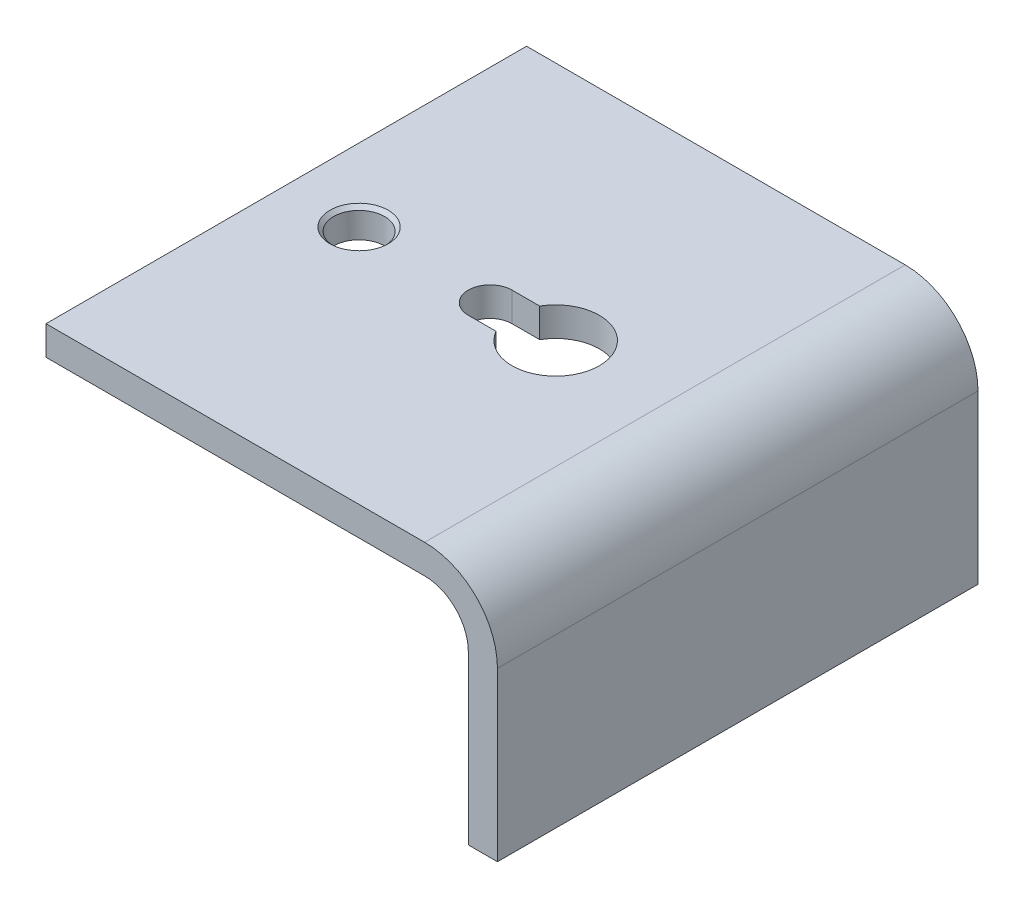
ISO-10303-21;
HEADER;
FILE_DESCRIPTION(('STEP AP214'),'2;1');
FILE_NAME('part.step','',(''),(''),'','','');
FILE_SCHEMA(('AUTOMOTIVE_DESIGN { 1 0 10303 214 1 1 1 1 }'));
ENDSEC;
DATA;
#1=APPLICATION_CONTEXT('core data for automotive mechanical design processes');
#2=APPLICATION_PROTOCOL_DEFINITION('international standard','automotive_design',2000,#1);
#3=PRODUCT_CONTEXT('',#1,'mechanical');
#4=PRODUCT('Part','Part','',(#3));
#5=PRODUCT_RELATED_PRODUCT_CATEGORY('part','',(#4));
#6=PRODUCT_DEFINITION_FORMATION('','',#4);
#7=PRODUCT_DEFINITION_CONTEXT('part definition',#1,'design');
#8=PRODUCT_DEFINITION('design','',#6,#7);
#9=PRODUCT_DEFINITION_SHAPE('','',#8);
#10=(LENGTH_UNIT() NAMED_UNIT(*) SI_UNIT(.MILLI.,.METRE.));
#11=(NAMED_UNIT(*) PLANE_ANGLE_UNIT() SI_UNIT($,.RADIAN.));
#12=(NAMED_UNIT(*) SI_UNIT($,.STERADIAN.) SOLID_ANGLE_UNIT());
#13=UNCERTAINTY_MEASURE_WITH_UNIT(LENGTH_MEASURE(1.E-05),#10,'distance_accuracy_value','');
#14=(GEOMETRIC_REPRESENTATION_CONTEXT(3) GLOBAL_UNCERTAINTY_ASSIGNED_CONTEXT((#13)) GLOBAL_UNIT_ASSIGNED_CONTEXT((#10,
#11,#12)) REPRESENTATION_CONTEXT('',''));
#15=CARTESIAN_POINT('',(0.,0.,0.));
#16=DIRECTION('',(0.,0.,1.));
#17=DIRECTION('',(1.,0.,0.));
#18=AXIS2_PLACEMENT_3D('',#15,#16,#17);
#19=CARTESIAN_POINT('',(52.,23.,66.));
#20=DIRECTION('',(0.,0.,-1.));
#21=DIRECTION('',(-1.,0.,0.));
#22=AXIS2_PLACEMENT_3D('',#19,#20,#21);
#23=CYLINDRICAL_SURFACE('',#22,10.);
#24=CARTESIAN_POINT('',(52.,23.,0.));
#25=DIRECTION('',(0.,0.,1.));
#26=DIRECTION('',(-1.,0.,0.));
#27=AXIS2_PLACEMENT_3D('',#24,#25,#26);
#28=CIRCLE('',#27,10.);
#29=CARTESIAN_POINT('',(62.,22.9999999999999,0.));
#30=VERTEX_POINT('',#29);
#31=CARTESIAN_POINT('',(51.9999999999999,33.,0.));
#32=VERTEX_POINT('',#31);
#33=EDGE_CURVE('E152',#30,#32,#28,.T.);
#34=ORIENTED_EDGE('',*,*,#33,.T.);
#35=DIRECTION('',(0.,0.,-1.));
#36=VECTOR('',#35,1.);
#37=CARTESIAN_POINT('',(51.9999999999999,33.,66.));
#38=LINE('',#37,#36);
#39=CARTESIAN_POINT('',(51.9999999999999,33.,66.));
#40=VERTEX_POINT('',#39);
#41=EDGE_CURVE('E209',#40,#32,#38,.T.);
#42=ORIENTED_EDGE('',*,*,#41,.F.);
#43=CARTESIAN_POINT('',(52.,23.,66.));
#44=DIRECTION('',(0.,0.,1.));
#45=DIRECTION('',(-1.,0.,0.));
#46=AXIS2_PLACEMENT_3D('',#43,#44,#45);
#47=CIRCLE('',#46,10.);
#48=CARTESIAN_POINT('',(62.,22.9999999999999,66.));
#49=VERTEX_POINT('',#48);
#50=EDGE_CURVE('E155',#49,#40,#47,.T.);
#51=ORIENTED_EDGE('',*,*,#50,.F.);
#52=DIRECTION('',(0.,0.,-1.));
#53=VECTOR('',#52,1.);
#54=CARTESIAN_POINT('',(62.,22.9999999999999,66.));
#55=LINE('',#54,#53);
#56=EDGE_CURVE('E173',#49,#30,#55,.T.);
#57=ORIENTED_EDGE('',*,*,#56,.T.);
#58=EDGE_LOOP('',(#34,#42,#51,#57));
#59=FACE_BOUND('',#58,.T.);
#60=ADVANCED_FACE('F36',(#59),#23,.T.);
#61=CARTESIAN_POINT('',(0.,33.,66.));
#62=DIRECTION('',(0.,-1.,0.));
#63=DIRECTION('',(0.,0.,-1.));
#64=AXIS2_PLACEMENT_3D('',#61,#62,#63);
#65=PLANE('',#64);
#66=CARTESIAN_POINT('',(9.99999999999999,33.,33.));
#67=DIRECTION('',(0.,-1.,0.));
#68=DIRECTION('',(0.,0.,-1.));
#69=AXIS2_PLACEMENT_3D('',#66,#67,#68);
#70=CIRCLE('',#69,4.00000000000002);
#71=CARTESIAN_POINT('',(9.99999999999999,33.,29.));
#72=VERTEX_POINT('',#71);
#73=EDGE_CURVE('E11',#72,#72,#70,.T.);
#74=ORIENTED_EDGE('',*,*,#73,.T.);
#75=EDGE_LOOP('',(#74));
#76=FACE_BOUND('',#75,.T.);
#77=DIRECTION('',(1.,0.,0.));
#78=VECTOR('',#77,1.);
#79=CARTESIAN_POINT('',(27.9999999999999,33.,36.));
#80=LINE('',#79,#78);
#81=CARTESIAN_POINT('',(27.9999999999999,33.,36.));
#82=VERTEX_POINT('',#81);
#83=CARTESIAN_POINT('',(31.8038475772933,33.,36.));
#84=VERTEX_POINT('',#83);
#85=EDGE_CURVE('E138',#82,#84,#80,.T.);
#86=ORIENTED_EDGE('',*,*,#85,.F.);
#87=CARTESIAN_POINT('',(27.9999999999999,33.,33.));
#88=DIRECTION('',(0.,1.,0.));
#89=DIRECTION('',(0.,0.,1.));
#90=AXIS2_PLACEMENT_3D('',#87,#88,#89);
#91=CIRCLE('',#90,3.);
#92=CARTESIAN_POINT('',(27.9999999999999,33.,30.));
#93=VERTEX_POINT('',#92);
#94=EDGE_CURVE('E52',#93,#82,#91,.T.);
#95=ORIENTED_EDGE('',*,*,#94,.F.);
#96=DIRECTION('',(-1.,0.,0.));
#97=VECTOR('',#96,1.);
#98=CARTESIAN_POINT('',(27.9999999999999,33.,30.));
#99=LINE('',#98,#97);
#100=CARTESIAN_POINT('',(31.8038475772933,33.,30.));
#101=VERTEX_POINT('',#100);
#102=EDGE_CURVE('E145',#101,#93,#99,.T.);
#103=ORIENTED_EDGE('',*,*,#102,.F.);
#104=CARTESIAN_POINT('',(36.9999999999999,33.,33.));
#105=DIRECTION('',(0.,1.,0.));
#106=DIRECTION('',(0.,0.,1.));
#107=AXIS2_PLACEMENT_3D('',#104,#105,#106);
#108=CIRCLE('',#107,5.99999999999999);
#109=EDGE_CURVE('E129',#84,#101,#108,.T.);
#110=ORIENTED_EDGE('',*,*,#109,.F.);
#111=EDGE_LOOP('',(#86,#95,#103,#110));
#112=FACE_BOUND('',#111,.T.);
#113=DIRECTION('',(-1.,0.,0.));
#114=VECTOR('',#113,1.);
#115=CARTESIAN_POINT('',(0.,33.,0.));
#116=LINE('',#115,#114);
#117=CARTESIAN_POINT('',(0.,33.,0.));
#118=VERTEX_POINT('',#117);
#119=EDGE_CURVE('E176',#32,#118,#116,.T.);
#120=ORIENTED_EDGE('',*,*,#119,.T.);
#121=DIRECTION('',(0.,0.,-1.));
#122=VECTOR('',#121,1.);
#123=CARTESIAN_POINT('',(0.,33.,66.));
#124=LINE('',#123,#122);
#125=CARTESIAN_POINT('',(0.,33.,66.));
#126=VERTEX_POINT('',#125);
#127=EDGE_CURVE('E206',#126,#118,#124,.T.);
#128=ORIENTED_EDGE('',*,*,#127,.F.);
#129=DIRECTION('',(-1.,0.,0.));
#130=VECTOR('',#129,1.);
#131=CARTESIAN_POINT('',(0.,33.,66.));
#132=LINE('',#131,#130);
#133=EDGE_CURVE('E158',#40,#126,#132,.T.);
#134=ORIENTED_EDGE('',*,*,#133,.F.);
#135=ORIENTED_EDGE('',*,*,#41,.T.);
#136=EDGE_LOOP('',(#120,#128,#134,#135));
#137=FACE_BOUND('',#136,.T.);
#138=ADVANCED_FACE('F142',(#76,#112,#137),#65,.F.);
#139=CARTESIAN_POINT('',(0.,33.,66.));
#140=DIRECTION('',(1.,0.,0.));
#141=DIRECTION('',(0.,0.,-1.));
#142=AXIS2_PLACEMENT_3D('',#139,#140,#141);
#143=PLANE('',#142);
#144=DIRECTION('',(0.,-1.,0.));
#145=VECTOR('',#144,1.);
#146=CARTESIAN_POINT('',(0.,33.,0.));
#147=LINE('',#146,#145);
#148=CARTESIAN_POINT('',(0.,29.,0.));
#149=VERTEX_POINT('',#148);
#150=EDGE_CURVE('E178',#118,#149,#147,.T.);
#151=ORIENTED_EDGE('',*,*,#150,.T.);
#152=DIRECTION('',(0.,0.,-1.));
#153=VECTOR('',#152,1.);
#154=CARTESIAN_POINT('',(0.,29.,66.));
#155=LINE('',#154,#153);
#156=CARTESIAN_POINT('',(0.,29.,66.));
#157=VERTEX_POINT('',#156);
#158=EDGE_CURVE('E203',#157,#149,#155,.T.);
#159=ORIENTED_EDGE('',*,*,#158,.F.);
#160=DIRECTION('',(0.,-1.,0.));
#161=VECTOR('',#160,1.);
#162=CARTESIAN_POINT('',(0.,33.,66.));
#163=LINE('',#162,#161);
#164=EDGE_CURVE('E161',#126,#157,#163,.T.);
#165=ORIENTED_EDGE('',*,*,#164,.F.);
#166=ORIENTED_EDGE('',*,*,#127,.T.);
#167=EDGE_LOOP('',(#151,#159,#165,#166));
#168=FACE_BOUND('',#167,.T.);
#169=ADVANCED_FACE('F241',(#168),#143,.F.);
#170=CARTESIAN_POINT('',(0.,29.,66.));
#171=DIRECTION('',(0.,1.,0.));
#172=DIRECTION('',(0.,0.,1.));
#173=AXIS2_PLACEMENT_3D('',#170,#171,#172);
#174=PLANE('',#173);
#175=CARTESIAN_POINT('',(9.99999999999999,29.,33.));
#176=DIRECTION('',(0.,1.,0.));
#177=DIRECTION('',(0.,0.,1.));
#178=AXIS2_PLACEMENT_3D('',#175,#176,#177);
#179=CIRCLE('',#178,3.5);
#180=CARTESIAN_POINT('',(9.99999999999999,29.,36.5));
#181=VERTEX_POINT('',#180);
#182=EDGE_CURVE('E221',#181,#181,#179,.T.);
#183=ORIENTED_EDGE('',*,*,#182,.T.);
#184=EDGE_LOOP('',(#183));
#185=FACE_BOUND('',#184,.T.);
#186=DIRECTION('',(-1.,0.,0.));
#187=VECTOR('',#186,1.);
#188=CARTESIAN_POINT('',(0.,29.,30.));
#189=LINE('',#188,#187);
#190=CARTESIAN_POINT('',(31.8038475772933,29.,30.));
#191=VERTEX_POINT('',#190);
#192=CARTESIAN_POINT('',(27.9999999999999,29.,30.));
#193=VERTEX_POINT('',#192);
#194=EDGE_CURVE('E215',#191,#193,#189,.T.);
#195=ORIENTED_EDGE('',*,*,#194,.T.);
#196=CARTESIAN_POINT('',(27.9999999999999,29.,33.));
#197=DIRECTION('',(0.,1.,0.));
#198=DIRECTION('',(0.,0.,1.));
#199=AXIS2_PLACEMENT_3D('',#196,#197,#198);
#200=CIRCLE('',#199,3.);
#201=CARTESIAN_POINT('',(27.9999999999999,29.,36.));
#202=VERTEX_POINT('',#201);
#203=EDGE_CURVE('E218',#193,#202,#200,.T.);
#204=ORIENTED_EDGE('',*,*,#203,.T.);
#205=DIRECTION('',(1.,0.,0.));
#206=VECTOR('',#205,1.);
#207=CARTESIAN_POINT('',(0.,29.,36.));
#208=LINE('',#207,#206);
#209=CARTESIAN_POINT('',(31.8038475772933,29.,36.));
#210=VERTEX_POINT('',#209);
#211=EDGE_CURVE('E212',#202,#210,#208,.T.);
#212=ORIENTED_EDGE('',*,*,#211,.T.);
#213=CARTESIAN_POINT('',(36.9999999999999,29.,33.));
#214=DIRECTION('',(0.,1.,0.));
#215=DIRECTION('',(0.,0.,1.));
#216=AXIS2_PLACEMENT_3D('',#213,#214,#215);
#217=CIRCLE('',#216,5.99999999999999);
#218=EDGE_CURVE('E132',#210,#191,#217,.T.);
#219=ORIENTED_EDGE('',*,*,#218,.T.);
#220=EDGE_LOOP('',(#195,#204,#212,#219));
#221=FACE_BOUND('',#220,.T.);
#222=DIRECTION('',(1.,0.,0.));
#223=VECTOR('',#222,1.);
#224=CARTESIAN_POINT('',(0.,29.,0.));
#225=LINE('',#224,#223);
#226=CARTESIAN_POINT('',(51.9999999999999,29.,0.));
#227=VERTEX_POINT('',#226);
#228=EDGE_CURVE('E180',#149,#227,#225,.T.);
#229=ORIENTED_EDGE('',*,*,#228,.T.);
#230=DIRECTION('',(0.,0.,-1.));
#231=VECTOR('',#230,1.);
#232=CARTESIAN_POINT('',(51.9999999999999,29.,66.));
#233=LINE('',#232,#231);
#234=CARTESIAN_POINT('',(51.9999999999999,29.,66.));
#235=VERTEX_POINT('',#234);
#236=EDGE_CURVE('E200',#235,#227,#233,.T.);
#237=ORIENTED_EDGE('',*,*,#236,.F.);
#238=DIRECTION('',(1.,0.,0.));
#239=VECTOR('',#238,1.);
#240=CARTESIAN_POINT('',(0.,29.,66.));
#241=LINE('',#240,#239);
#242=EDGE_CURVE('E163',#157,#235,#241,.T.);
#243=ORIENTED_EDGE('',*,*,#242,.F.);
#244=ORIENTED_EDGE('',*,*,#158,.T.);
#245=EDGE_LOOP('',(#229,#237,#243,#244));
#246=FACE_BOUND('',#245,.T.);
#247=ADVANCED_FACE('F247',(#185,#221,#246),#174,.F.);
#248=CARTESIAN_POINT('',(52.,23.,66.));
#249=DIRECTION('',(0.,0.,-1.));
#250=DIRECTION('',(-1.,0.,0.));
#251=AXIS2_PLACEMENT_3D('',#248,#249,#250);
#252=CYLINDRICAL_SURFACE('',#251,6.);
#253=CARTESIAN_POINT('',(52.,23.,0.));
#254=DIRECTION('',(0.,0.,-1.));
#255=DIRECTION('',(-1.,0.,0.));
#256=AXIS2_PLACEMENT_3D('',#253,#254,#255);
#257=CIRCLE('',#256,6.);
#258=CARTESIAN_POINT('',(58.,23.,0.));
#259=VERTEX_POINT('',#258);
#260=EDGE_CURVE('E182',#227,#259,#257,.T.);
#261=ORIENTED_EDGE('',*,*,#260,.T.);
#262=DIRECTION('',(0.,0.,-1.));
#263=VECTOR('',#262,1.);
#264=CARTESIAN_POINT('',(58.,23.,66.));
#265=LINE('',#264,#263);
#266=CARTESIAN_POINT('',(58.,23.,66.));
#267=VERTEX_POINT('',#266);
#268=EDGE_CURVE('E197',#267,#259,#265,.T.);
#269=ORIENTED_EDGE('',*,*,#268,.F.);
#270=CARTESIAN_POINT('',(52.,23.,66.));
#271=DIRECTION('',(0.,0.,-1.));
#272=DIRECTION('',(-1.,0.,0.));
#273=AXIS2_PLACEMENT_3D('',#270,#271,#272);
#274=CIRCLE('',#273,6.);
#275=EDGE_CURVE('E165',#235,#267,#274,.T.);
#276=ORIENTED_EDGE('',*,*,#275,.F.);
#277=ORIENTED_EDGE('',*,*,#236,.T.);
#278=EDGE_LOOP('',(#261,#269,#276,#277));
#279=FACE_BOUND('',#278,.T.);
#280=ADVANCED_FACE('F251',(#279),#252,.F.);
#281=CARTESIAN_POINT('',(58.,0.,66.));
#282=DIRECTION('',(1.,0.,0.));
#283=DIRECTION('',(0.,1.,0.));
#284=AXIS2_PLACEMENT_3D('',#281,#282,#283);
#285=PLANE('',#284);
#286=DIRECTION('',(0.,-1.,0.));
#287=VECTOR('',#286,1.);
#288=CARTESIAN_POINT('',(58.,0.,0.));
#289=LINE('',#288,#287);
#290=CARTESIAN_POINT('',(58.,0.,0.));
#291=VERTEX_POINT('',#290);
#292=EDGE_CURVE('E184',#259,#291,#289,.T.);
#293=ORIENTED_EDGE('',*,*,#292,.T.);
#294=DIRECTION('',(0.,0.,-1.));
#295=VECTOR('',#294,1.);
#296=CARTESIAN_POINT('',(58.,0.,66.));
#297=LINE('',#296,#295);
#298=CARTESIAN_POINT('',(58.,0.,66.));
#299=VERTEX_POINT('',#298);
#300=EDGE_CURVE('E194',#299,#291,#297,.T.);
#301=ORIENTED_EDGE('',*,*,#300,.F.);
#302=DIRECTION('',(0.,-1.,0.));
#303=VECTOR('',#302,1.);
#304=CARTESIAN_POINT('',(58.,0.,66.));
#305=LINE('',#304,#303);
#306=EDGE_CURVE('E167',#267,#299,#305,.T.);
#307=ORIENTED_EDGE('',*,*,#306,.F.);
#308=ORIENTED_EDGE('',*,*,#268,.T.);
#309=EDGE_LOOP('',(#293,#301,#307,#308));
#310=FACE_BOUND('',#309,.T.);
#311=ADVANCED_FACE('F255',(#310),#285,.F.);
#312=CARTESIAN_POINT('',(62.,0.,66.));
#313=DIRECTION('',(0.,1.,0.));
#314=DIRECTION('',(0.,0.,1.));
#315=AXIS2_PLACEMENT_3D('',#312,#313,#314);
#316=PLANE('',#315);
#317=DIRECTION('',(1.,0.,0.));
#318=VECTOR('',#317,1.);
#319=CARTESIAN_POINT('',(62.,0.,0.));
#320=LINE('',#319,#318);
#321=CARTESIAN_POINT('',(62.,0.,0.));
#322=VERTEX_POINT('',#321);
#323=EDGE_CURVE('E186',#291,#322,#320,.T.);
#324=ORIENTED_EDGE('',*,*,#323,.T.);
#325=DIRECTION('',(0.,0.,-1.));
#326=VECTOR('',#325,1.);
#327=CARTESIAN_POINT('',(62.,0.,66.));
#328=LINE('',#327,#326);
#329=CARTESIAN_POINT('',(62.,0.,66.));
#330=VERTEX_POINT('',#329);
#331=EDGE_CURVE('E191',#330,#322,#328,.T.);
#332=ORIENTED_EDGE('',*,*,#331,.F.);
#333=DIRECTION('',(1.,0.,0.));
#334=VECTOR('',#333,1.);
#335=CARTESIAN_POINT('',(62.,0.,66.));
#336=LINE('',#335,#334);
#337=EDGE_CURVE('E169',#299,#330,#336,.T.);
#338=ORIENTED_EDGE('',*,*,#337,.F.);
#339=ORIENTED_EDGE('',*,*,#300,.T.);
#340=EDGE_LOOP('',(#324,#332,#338,#339));
#341=FACE_BOUND('',#340,.T.);
#342=ADVANCED_FACE('F259',(#341),#316,.F.);
#343=CARTESIAN_POINT('',(62.,0.,66.));
#344=DIRECTION('',(-1.,0.,0.));
#345=DIRECTION('',(0.,0.,1.));
#346=AXIS2_PLACEMENT_3D('',#343,#344,#345);
#347=PLANE('',#346);
#348=DIRECTION('',(0.,1.,0.));
#349=VECTOR('',#348,1.);
#350=CARTESIAN_POINT('',(62.,0.,0.));
#351=LINE('',#350,#349);
#352=EDGE_CURVE('E159',#322,#30,#351,.T.);
#353=ORIENTED_EDGE('',*,*,#352,.T.);
#354=ORIENTED_EDGE('',*,*,#56,.F.);
#355=DIRECTION('',(0.,1.,0.));
#356=VECTOR('',#355,1.);
#357=CARTESIAN_POINT('',(62.,0.,66.));
#358=LINE('',#357,#356);
#359=EDGE_CURVE('E171',#330,#49,#358,.T.);
#360=ORIENTED_EDGE('',*,*,#359,.F.);
#361=ORIENTED_EDGE('',*,*,#331,.T.);
#362=EDGE_LOOP('',(#353,#354,#360,#361));
#363=FACE_BOUND('',#362,.T.);
#364=ADVANCED_FACE('F263',(#363),#347,.F.);
#365=CARTESIAN_POINT('',(52.,23.,66.));
#366=DIRECTION('',(0.,0.,-1.));
#367=DIRECTION('',(-1.,0.,0.));
#368=AXIS2_PLACEMENT_3D('',#365,#366,#367);
#369=PLANE('',#368);
#370=ORIENTED_EDGE('',*,*,#50,.T.);
#371=ORIENTED_EDGE('',*,*,#133,.T.);
#372=ORIENTED_EDGE('',*,*,#164,.T.);
#373=ORIENTED_EDGE('',*,*,#242,.T.);
#374=ORIENTED_EDGE('',*,*,#275,.T.);
#375=ORIENTED_EDGE('',*,*,#306,.T.);
#376=ORIENTED_EDGE('',*,*,#337,.T.);
#377=ORIENTED_EDGE('',*,*,#359,.T.);
#378=EDGE_LOOP('',(#370,#371,#372,#373,#374,#375,#376,#377));
#379=FACE_BOUND('',#378,.T.);
#380=ADVANCED_FACE('F267',(#379),#369,.F.);
#381=CARTESIAN_POINT('',(52.,23.,0.));
#382=DIRECTION('',(0.,0.,-1.));
#383=DIRECTION('',(-1.,0.,0.));
#384=AXIS2_PLACEMENT_3D('',#381,#382,#383);
#385=PLANE('',#384);
#386=ORIENTED_EDGE('',*,*,#33,.F.);
#387=ORIENTED_EDGE('',*,*,#352,.F.);
#388=ORIENTED_EDGE('',*,*,#323,.F.);
#389=ORIENTED_EDGE('',*,*,#292,.F.);
#390=ORIENTED_EDGE('',*,*,#260,.F.);
#391=ORIENTED_EDGE('',*,*,#228,.F.);
#392=ORIENTED_EDGE('',*,*,#150,.F.);
#393=ORIENTED_EDGE('',*,*,#119,.F.);
#394=EDGE_LOOP('',(#386,#387,#388,#389,#390,#391,#392,#393));
#395=FACE_BOUND('',#394,.T.);
#396=ADVANCED_FACE('F269',(#395),#385,.T.);
#397=CARTESIAN_POINT('',(27.9999999999999,23.,33.));
#398=DIRECTION('',(0.,1.,0.));
#399=DIRECTION('',(0.,0.,1.));
#400=AXIS2_PLACEMENT_3D('',#397,#398,#399);
#401=CYLINDRICAL_SURFACE('',#400,3.);
#402=DIRECTION('',(0.,1.,0.));
#403=VECTOR('',#402,1.);
#404=CARTESIAN_POINT('',(27.9999999999999,23.,30.));
#405=LINE('',#404,#403);
#406=EDGE_CURVE('E150',#193,#93,#405,.T.);
#407=ORIENTED_EDGE('',*,*,#406,.T.);
#408=ORIENTED_EDGE('',*,*,#94,.T.);
#409=DIRECTION('',(0.,1.,0.));
#410=VECTOR('',#409,1.);
#411=CARTESIAN_POINT('',(27.9999999999999,23.,36.));
#412=LINE('',#411,#410);
#413=EDGE_CURVE('E135',#202,#82,#412,.T.);
#414=ORIENTED_EDGE('',*,*,#413,.F.);
#415=ORIENTED_EDGE('',*,*,#203,.F.);
#416=EDGE_LOOP('',(#407,#408,#414,#415));
#417=FACE_BOUND('',#416,.T.);
#418=ADVANCED_FACE('F272',(#417),#401,.F.);
#419=CARTESIAN_POINT('',(27.9999999999999,23.,30.));
#420=DIRECTION('',(0.,0.,-1.));
#421=DIRECTION('',(-1.,0.,0.));
#422=AXIS2_PLACEMENT_3D('',#419,#420,#421);
#423=PLANE('',#422);
#424=DIRECTION('',(0.,1.,0.));
#425=VECTOR('',#424,1.);
#426=CARTESIAN_POINT('',(31.8038475772933,23.,30.));
#427=LINE('',#426,#425);
#428=EDGE_CURVE('E134',#191,#101,#427,.T.);
#429=ORIENTED_EDGE('',*,*,#428,.T.);
#430=ORIENTED_EDGE('',*,*,#102,.T.);
#431=ORIENTED_EDGE('',*,*,#406,.F.);
#432=ORIENTED_EDGE('',*,*,#194,.F.);
#433=EDGE_LOOP('',(#429,#430,#431,#432));
#434=FACE_BOUND('',#433,.T.);
#435=ADVANCED_FACE('F279',(#434),#423,.F.);
#436=CARTESIAN_POINT('',(36.9999999999999,23.,33.));
#437=DIRECTION('',(0.,1.,0.));
#438=DIRECTION('',(0.,0.,1.));
#439=AXIS2_PLACEMENT_3D('',#436,#437,#438);
#440=CYLINDRICAL_SURFACE('',#439,5.99999999999999);
#441=DIRECTION('',(0.,1.,0.));
#442=VECTOR('',#441,1.);
#443=CARTESIAN_POINT('',(31.8038475772933,23.,36.));
#444=LINE('',#443,#442);
#445=EDGE_CURVE('E60',#210,#84,#444,.T.);
#446=ORIENTED_EDGE('',*,*,#445,.T.);
#447=ORIENTED_EDGE('',*,*,#109,.T.);
#448=ORIENTED_EDGE('',*,*,#428,.F.);
#449=ORIENTED_EDGE('',*,*,#218,.F.);
#450=EDGE_LOOP('',(#446,#447,#448,#449));
#451=FACE_BOUND('',#450,.T.);
#452=ADVANCED_FACE('F126',(#451),#440,.F.);
#453=CARTESIAN_POINT('',(27.9999999999999,23.,36.));
#454=DIRECTION('',(0.,0.,1.));
#455=DIRECTION('',(1.,0.,0.));
#456=AXIS2_PLACEMENT_3D('',#453,#454,#455);
#457=PLANE('',#456);
#458=ORIENTED_EDGE('',*,*,#413,.T.);
#459=ORIENTED_EDGE('',*,*,#85,.T.);
#460=ORIENTED_EDGE('',*,*,#445,.F.);
#461=ORIENTED_EDGE('',*,*,#211,.F.);
#462=EDGE_LOOP('',(#458,#459,#460,#461));
#463=FACE_BOUND('',#462,.T.);
#464=ADVANCED_FACE('F139',(#463),#457,.F.);
#465=CARTESIAN_POINT('',(9.99999999999999,23.,33.));
#466=DIRECTION('',(0.,1.,0.));
#467=DIRECTION('',(0.,0.,1.));
#468=AXIS2_PLACEMENT_3D('',#465,#466,#467);
#469=CYLINDRICAL_SURFACE('',#468,3.5);
#470=CARTESIAN_POINT('',(9.99999999999999,32.5,33.));
#471=DIRECTION('',(0.,-1.,0.));
#472=DIRECTION('',(0.,0.,-1.));
#473=AXIS2_PLACEMENT_3D('',#470,#471,#472);
#474=CIRCLE('',#473,3.5);
#475=CARTESIAN_POINT('',(9.99999999999999,32.5,29.5));
#476=VERTEX_POINT('',#475);
#477=EDGE_CURVE('E45',#476,#476,#474,.F.);
#478=ORIENTED_EDGE('',*,*,#477,.T.);
#479=EDGE_LOOP('',(#478));
#480=FACE_BOUND('',#479,.T.);
#481=ORIENTED_EDGE('',*,*,#182,.F.);
#482=EDGE_LOOP('',(#481));
#483=FACE_BOUND('',#482,.T.);
#484=ADVANCED_FACE('F226',(#480,#483),#469,.F.);
#485=CARTESIAN_POINT('',(9.99999999999999,32.5,33.));
#486=DIRECTION('',(0.,1.,0.));
#487=DIRECTION('',(0.,0.,1.));
#488=AXIS2_PLACEMENT_3D('',#485,#486,#487);
#489=CONICAL_SURFACE('',#488,3.5,0.785398163397444);
#490=ORIENTED_EDGE('',*,*,#73,.F.);
#491=EDGE_LOOP('',(#490));
#492=FACE_BOUND('',#491,.T.);
#493=ORIENTED_EDGE('',*,*,#477,.F.);
#494=EDGE_LOOP('',(#493));
#495=FACE_BOUND('',#494,.T.);
#496=ADVANCED_FACE('F39',(#492,#495),#489,.F.);
#497=CLOSED_SHELL('',(#60,#138,#169,#247,#280,#311,#342,#364,#380,#396,#418,#435,#452,#464,#484,#496));
#498=MANIFOLD_SOLID_BREP('B2',#497);
#499=ADVANCED_BREP_SHAPE_REPRESENTATION('',(#18,#498),#14);
#500=SHAPE_DEFINITION_REPRESENTATION(#9,#499);
ENDSEC;
END-ISO-10303-21;
